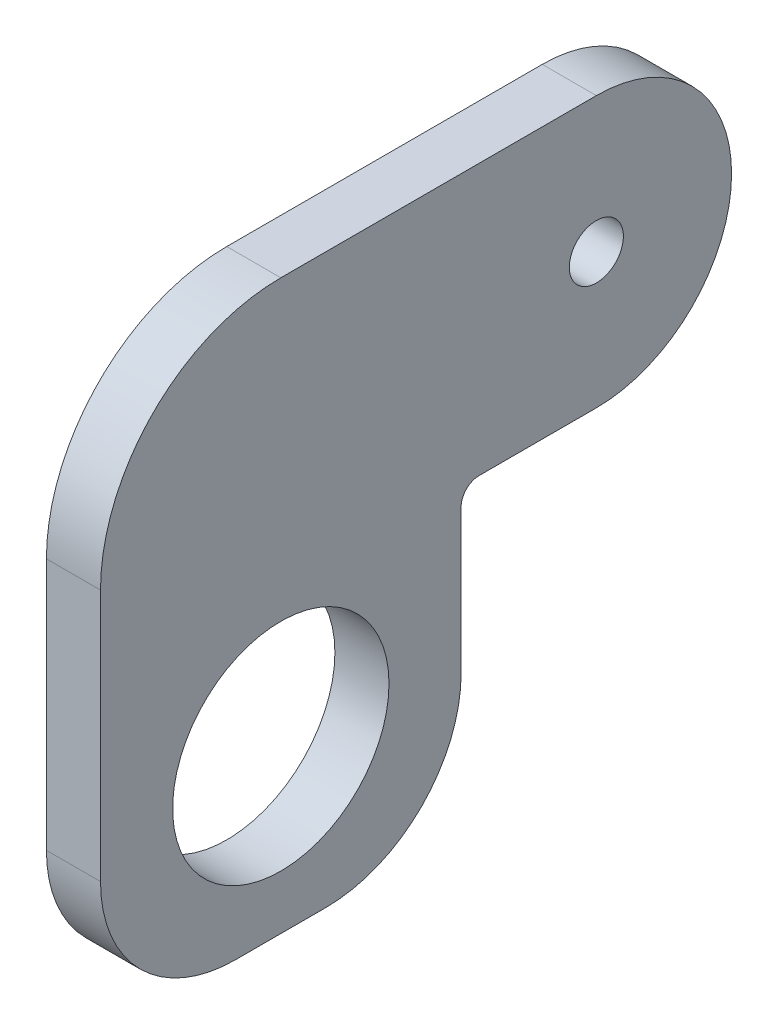
ISO-10303-21;
HEADER;
FILE_DESCRIPTION(('STEP AP214'),'2;1');
FILE_NAME('part.step','',(''),(''),'','','');
FILE_SCHEMA(('AUTOMOTIVE_DESIGN { 1 0 10303 214 1 1 1 1 }'));
ENDSEC;
DATA;
#1=APPLICATION_CONTEXT('core data for automotive mechanical design processes');
#2=APPLICATION_PROTOCOL_DEFINITION('international standard','automotive_design',2000,#1);
#3=PRODUCT_CONTEXT('',#1,'mechanical');
#4=PRODUCT('Part','Part','',(#3));
#5=PRODUCT_RELATED_PRODUCT_CATEGORY('part','',(#4));
#6=PRODUCT_DEFINITION_FORMATION('','',#4);
#7=PRODUCT_DEFINITION_CONTEXT('part definition',#1,'design');
#8=PRODUCT_DEFINITION('design','',#6,#7);
#9=PRODUCT_DEFINITION_SHAPE('','',#8);
#10=(LENGTH_UNIT() NAMED_UNIT(*) SI_UNIT(.MILLI.,.METRE.));
#11=(NAMED_UNIT(*) PLANE_ANGLE_UNIT() SI_UNIT($,.RADIAN.));
#12=(NAMED_UNIT(*) SI_UNIT($,.STERADIAN.) SOLID_ANGLE_UNIT());
#13=UNCERTAINTY_MEASURE_WITH_UNIT(LENGTH_MEASURE(1.E-05),#10,'distance_accuracy_value','');
#14=(GEOMETRIC_REPRESENTATION_CONTEXT(3) GLOBAL_UNCERTAINTY_ASSIGNED_CONTEXT((#13)) GLOBAL_UNIT_ASSIGNED_CONTEXT((#10,
#11,#12)) REPRESENTATION_CONTEXT('',''));
#15=CARTESIAN_POINT('',(0.,0.,0.));
#16=DIRECTION('',(0.,0.,1.));
#17=DIRECTION('',(1.,0.,0.));
#18=AXIS2_PLACEMENT_3D('',#15,#16,#17);
#19=CARTESIAN_POINT('',(1.5,12.5,17.5));
#20=DIRECTION('',(-1.,0.,0.));
#21=DIRECTION('',(0.,0.,1.));
#22=AXIS2_PLACEMENT_3D('',#19,#20,#21);
#23=PLANE('',#22);
#24=DIRECTION('',(0.,-1.,0.));
#25=VECTOR('',#24,1.);
#26=CARTESIAN_POINT('',(1.5,-9.,27.5));
#27=LINE('',#26,#25);
#28=CARTESIAN_POINT('',(1.5,12.4999999999999,27.5));
#29=VERTEX_POINT('',#28);
#30=CARTESIAN_POINT('',(1.5,-1.5,27.5));
#31=VERTEX_POINT('',#30);
#32=EDGE_CURVE('E142',#29,#31,#27,.T.);
#33=ORIENTED_EDGE('',*,*,#32,.T.);
#34=CARTESIAN_POINT('',(1.5,-1.5,20.));
#35=DIRECTION('',(-1.,0.,0.));
#36=DIRECTION('',(0.,0.,1.));
#37=AXIS2_PLACEMENT_3D('',#34,#35,#36);
#38=CIRCLE('',#37,7.5);
#39=CARTESIAN_POINT('',(1.5,-9.,20.));
#40=VERTEX_POINT('',#39);
#41=EDGE_CURVE('E186',#31,#40,#38,.F.);
#42=ORIENTED_EDGE('',*,*,#41,.T.);
#43=DIRECTION('',(0.,0.,-1.));
#44=VECTOR('',#43,1.);
#45=CARTESIAN_POINT('',(1.5,-9.,27.5));
#46=LINE('',#45,#44);
#47=CARTESIAN_POINT('',(1.5,-9.,15.));
#48=VERTEX_POINT('',#47);
#49=EDGE_CURVE('E144',#40,#48,#46,.T.);
#50=ORIENTED_EDGE('',*,*,#49,.T.);
#51=CARTESIAN_POINT('',(1.5,-1.5,15.));
#52=DIRECTION('',(-1.,0.,0.));
#53=DIRECTION('',(0.,0.,1.));
#54=AXIS2_PLACEMENT_3D('',#51,#52,#53);
#55=CIRCLE('',#54,7.5);
#56=CARTESIAN_POINT('',(1.5,-1.5,7.5));
#57=VERTEX_POINT('',#56);
#58=EDGE_CURVE('E184',#48,#57,#55,.F.);
#59=ORIENTED_EDGE('',*,*,#58,.T.);
#60=DIRECTION('',(0.,1.,0.));
#61=VECTOR('',#60,1.);
#62=CARTESIAN_POINT('',(1.5,-9.,7.5));
#63=LINE('',#62,#61);
#64=CARTESIAN_POINT('',(1.5,6.5,7.5));
#65=VERTEX_POINT('',#64);
#66=EDGE_CURVE('E164',#57,#65,#63,.T.);
#67=ORIENTED_EDGE('',*,*,#66,.T.);
#68=CARTESIAN_POINT('',(1.5,6.5,6.5));
#69=DIRECTION('',(-1.,0.,0.));
#70=DIRECTION('',(0.,0.,1.));
#71=AXIS2_PLACEMENT_3D('',#68,#69,#70);
#72=CIRCLE('',#71,1.);
#73=CARTESIAN_POINT('',(1.5,7.5,6.5));
#74=VERTEX_POINT('',#73);
#75=EDGE_CURVE('E11',#65,#74,#72,.T.);
#76=ORIENTED_EDGE('',*,*,#75,.T.);
#77=DIRECTION('',(0.,0.,-1.));
#78=VECTOR('',#77,1.);
#79=CARTESIAN_POINT('',(1.5,7.5,7.5));
#80=LINE('',#79,#78);
#81=CARTESIAN_POINT('',(1.5,7.5,0.));
#82=VERTEX_POINT('',#81);
#83=EDGE_CURVE('E127',#74,#82,#80,.T.);
#84=ORIENTED_EDGE('',*,*,#83,.T.);
#85=CARTESIAN_POINT('',(1.5,15.,0.));
#86=DIRECTION('',(-1.,0.,0.));
#87=DIRECTION('',(0.,0.,1.));
#88=AXIS2_PLACEMENT_3D('',#85,#86,#87);
#89=CIRCLE('',#88,7.5);
#90=CARTESIAN_POINT('',(1.5,15.,-7.5));
#91=VERTEX_POINT('',#90);
#92=EDGE_CURVE('E182',#82,#91,#89,.F.);
#93=ORIENTED_EDGE('',*,*,#92,.T.);
#94=CARTESIAN_POINT('',(1.5,15.,0.));
#95=DIRECTION('',(-1.,0.,0.));
#96=DIRECTION('',(0.,0.,1.));
#97=AXIS2_PLACEMENT_3D('',#94,#95,#96);
#98=CIRCLE('',#97,7.5);
#99=CARTESIAN_POINT('',(1.5,22.5,0.));
#100=VERTEX_POINT('',#99);
#101=EDGE_CURVE('E124',#91,#100,#98,.F.);
#102=ORIENTED_EDGE('',*,*,#101,.T.);
#103=DIRECTION('',(0.,0.,1.));
#104=VECTOR('',#103,1.);
#105=CARTESIAN_POINT('',(1.5,22.5,17.4999999999999));
#106=LINE('',#105,#104);
#107=CARTESIAN_POINT('',(1.5,22.5,17.4999999999999));
#108=VERTEX_POINT('',#107);
#109=EDGE_CURVE('E116',#100,#108,#106,.T.);
#110=ORIENTED_EDGE('',*,*,#109,.T.);
#111=CARTESIAN_POINT('',(1.5,12.5,17.5));
#112=DIRECTION('',(1.,0.,0.));
#113=DIRECTION('',(0.,0.,1.));
#114=AXIS2_PLACEMENT_3D('',#111,#112,#113);
#115=CIRCLE('',#114,10.);
#116=EDGE_CURVE('E121',#108,#29,#115,.T.);
#117=ORIENTED_EDGE('',*,*,#116,.T.);
#118=EDGE_LOOP('',(#33,#42,#50,#59,#67,#76,#84,#93,#102,#110,#117));
#119=FACE_BOUND('',#118,.T.);
#120=CARTESIAN_POINT('',(1.5,0.,17.5));
#121=DIRECTION('',(1.,0.,0.));
#122=DIRECTION('',(0.,0.,-1.));
#123=AXIS2_PLACEMENT_3D('',#120,#121,#122);
#124=CIRCLE('',#123,6.);
#125=CARTESIAN_POINT('',(1.5,0.,11.5));
#126=VERTEX_POINT('',#125);
#127=EDGE_CURVE('E153',#126,#126,#124,.T.);
#128=ORIENTED_EDGE('',*,*,#127,.F.);
#129=EDGE_LOOP('',(#128));
#130=FACE_BOUND('',#129,.T.);
#131=CARTESIAN_POINT('',(1.5,15.,0.));
#132=DIRECTION('',(1.,0.,0.));
#133=DIRECTION('',(0.,0.,-1.));
#134=AXIS2_PLACEMENT_3D('',#131,#132,#133);
#135=CIRCLE('',#134,1.5);
#136=CARTESIAN_POINT('',(1.5,15.,-1.5));
#137=VERTEX_POINT('',#136);
#138=EDGE_CURVE('E243',#137,#137,#135,.T.);
#139=ORIENTED_EDGE('',*,*,#138,.F.);
#140=EDGE_LOOP('',(#139));
#141=FACE_BOUND('',#140,.T.);
#142=ADVANCED_FACE('F34',(#119,#130,#141),#23,.F.);
#143=CARTESIAN_POINT('',(-1.5,12.5,17.5));
#144=DIRECTION('',(-1.,0.,0.));
#145=DIRECTION('',(0.,0.,1.));
#146=AXIS2_PLACEMENT_3D('',#143,#144,#145);
#147=PLANE('',#146);
#148=CARTESIAN_POINT('',(-1.5,0.,17.5));
#149=DIRECTION('',(1.,0.,0.));
#150=DIRECTION('',(0.,0.,-1.));
#151=AXIS2_PLACEMENT_3D('',#148,#149,#150);
#152=CIRCLE('',#151,6.);
#153=CARTESIAN_POINT('',(-1.5,0.,11.5));
#154=VERTEX_POINT('',#153);
#155=EDGE_CURVE('E240',#154,#154,#152,.T.);
#156=ORIENTED_EDGE('',*,*,#155,.T.);
#157=EDGE_LOOP('',(#156));
#158=FACE_BOUND('',#157,.T.);
#159=DIRECTION('',(0.,0.,-1.));
#160=VECTOR('',#159,1.);
#161=CARTESIAN_POINT('',(-1.5,-9.,27.5));
#162=LINE('',#161,#160);
#163=CARTESIAN_POINT('',(-1.5,-9.,20.));
#164=VERTEX_POINT('',#163);
#165=CARTESIAN_POINT('',(-1.5,-9.,15.));
#166=VERTEX_POINT('',#165);
#167=EDGE_CURVE('E161',#164,#166,#162,.T.);
#168=ORIENTED_EDGE('',*,*,#167,.F.);
#169=CARTESIAN_POINT('',(-1.5,-1.5,20.));
#170=DIRECTION('',(-1.,0.,0.));
#171=DIRECTION('',(0.,0.,1.));
#172=AXIS2_PLACEMENT_3D('',#169,#170,#171);
#173=CIRCLE('',#172,7.5);
#174=CARTESIAN_POINT('',(-1.5,-1.5,27.5));
#175=VERTEX_POINT('',#174);
#176=EDGE_CURVE('E177',#164,#175,#173,.T.);
#177=ORIENTED_EDGE('',*,*,#176,.T.);
#178=DIRECTION('',(0.,-1.,0.));
#179=VECTOR('',#178,1.);
#180=CARTESIAN_POINT('',(-1.5,-9.,27.5));
#181=LINE('',#180,#179);
#182=CARTESIAN_POINT('',(-1.5,12.4999999999999,27.5));
#183=VERTEX_POINT('',#182);
#184=EDGE_CURVE('E158',#183,#175,#181,.T.);
#185=ORIENTED_EDGE('',*,*,#184,.F.);
#186=CARTESIAN_POINT('',(-1.5,12.5,17.5));
#187=DIRECTION('',(1.,0.,0.));
#188=DIRECTION('',(0.,0.,1.));
#189=AXIS2_PLACEMENT_3D('',#186,#187,#188);
#190=CIRCLE('',#189,10.);
#191=CARTESIAN_POINT('',(-1.5,22.5,17.4999999999999));
#192=VERTEX_POINT('',#191);
#193=EDGE_CURVE('E156',#192,#183,#190,.T.);
#194=ORIENTED_EDGE('',*,*,#193,.F.);
#195=DIRECTION('',(0.,0.,1.));
#196=VECTOR('',#195,1.);
#197=CARTESIAN_POINT('',(-1.5,22.5,17.4999999999999));
#198=LINE('',#197,#196);
#199=CARTESIAN_POINT('',(-1.5,22.5,0.));
#200=VERTEX_POINT('',#199);
#201=EDGE_CURVE('E133',#200,#192,#198,.T.);
#202=ORIENTED_EDGE('',*,*,#201,.F.);
#203=CARTESIAN_POINT('',(-1.5,15.,0.));
#204=DIRECTION('',(-1.,0.,0.));
#205=DIRECTION('',(0.,0.,1.));
#206=AXIS2_PLACEMENT_3D('',#203,#204,#205);
#207=CIRCLE('',#206,7.5);
#208=CARTESIAN_POINT('',(-1.5,15.,-7.5));
#209=VERTEX_POINT('',#208);
#210=EDGE_CURVE('E170',#200,#209,#207,.T.);
#211=ORIENTED_EDGE('',*,*,#210,.T.);
#212=CARTESIAN_POINT('',(-1.5,15.,0.));
#213=DIRECTION('',(-1.,0.,0.));
#214=DIRECTION('',(0.,0.,1.));
#215=AXIS2_PLACEMENT_3D('',#212,#213,#214);
#216=CIRCLE('',#215,7.5);
#217=CARTESIAN_POINT('',(-1.5,7.5,0.));
#218=VERTEX_POINT('',#217);
#219=EDGE_CURVE('E172',#209,#218,#216,.T.);
#220=ORIENTED_EDGE('',*,*,#219,.T.);
#221=DIRECTION('',(0.,0.,-1.));
#222=VECTOR('',#221,1.);
#223=CARTESIAN_POINT('',(-1.5,7.5,7.5));
#224=LINE('',#223,#222);
#225=CARTESIAN_POINT('',(-1.5,7.5,6.5));
#226=VERTEX_POINT('',#225);
#227=EDGE_CURVE('E152',#226,#218,#224,.T.);
#228=ORIENTED_EDGE('',*,*,#227,.F.);
#229=CARTESIAN_POINT('',(-1.5,6.5,6.5));
#230=DIRECTION('',(-1.,0.,0.));
#231=DIRECTION('',(0.,0.,1.));
#232=AXIS2_PLACEMENT_3D('',#229,#230,#231);
#233=CIRCLE('',#232,1.);
#234=CARTESIAN_POINT('',(-1.5,6.5,7.5));
#235=VERTEX_POINT('',#234);
#236=EDGE_CURVE('E42',#226,#235,#233,.F.);
#237=ORIENTED_EDGE('',*,*,#236,.T.);
#238=DIRECTION('',(0.,1.,0.));
#239=VECTOR('',#238,1.);
#240=CARTESIAN_POINT('',(-1.5,-9.,7.5));
#241=LINE('',#240,#239);
#242=CARTESIAN_POINT('',(-1.5,-1.5,7.5));
#243=VERTEX_POINT('',#242);
#244=EDGE_CURVE('E150',#243,#235,#241,.T.);
#245=ORIENTED_EDGE('',*,*,#244,.F.);
#246=CARTESIAN_POINT('',(-1.5,-1.5,15.));
#247=DIRECTION('',(-1.,0.,0.));
#248=DIRECTION('',(0.,0.,1.));
#249=AXIS2_PLACEMENT_3D('',#246,#247,#248);
#250=CIRCLE('',#249,7.5);
#251=EDGE_CURVE('E175',#243,#166,#250,.T.);
#252=ORIENTED_EDGE('',*,*,#251,.T.);
#253=EDGE_LOOP('',(#168,#177,#185,#194,#202,#211,#220,#228,#237,#245,#252));
#254=FACE_BOUND('',#253,.T.);
#255=CARTESIAN_POINT('',(-1.5,15.,0.));
#256=DIRECTION('',(1.,0.,0.));
#257=DIRECTION('',(0.,0.,-1.));
#258=AXIS2_PLACEMENT_3D('',#255,#256,#257);
#259=CIRCLE('',#258,1.5);
#260=CARTESIAN_POINT('',(-1.5,15.,-1.5));
#261=VERTEX_POINT('',#260);
#262=EDGE_CURVE('E200',#261,#261,#259,.T.);
#263=ORIENTED_EDGE('',*,*,#262,.T.);
#264=EDGE_LOOP('',(#263));
#265=FACE_BOUND('',#264,.T.);
#266=ADVANCED_FACE('F210',(#158,#254,#265),#147,.T.);
#267=CARTESIAN_POINT('',(1.5,-9.,7.5));
#268=DIRECTION('',(0.,0.,1.));
#269=DIRECTION('',(0.,-1.,0.));
#270=AXIS2_PLACEMENT_3D('',#267,#268,#269);
#271=PLANE('',#270);
#272=ORIENTED_EDGE('',*,*,#244,.T.);
#273=DIRECTION('',(-1.,0.,0.));
#274=VECTOR('',#273,1.);
#275=CARTESIAN_POINT('',(1.5,6.5,7.5));
#276=LINE('',#275,#274);
#277=EDGE_CURVE('E55',#235,#65,#276,.F.);
#278=ORIENTED_EDGE('',*,*,#277,.T.);
#279=ORIENTED_EDGE('',*,*,#66,.F.);
#280=DIRECTION('',(-1.,0.,0.));
#281=VECTOR('',#280,1.);
#282=CARTESIAN_POINT('',(1.5,-1.5,7.5));
#283=LINE('',#282,#281);
#284=EDGE_CURVE('E188',#57,#243,#283,.T.);
#285=ORIENTED_EDGE('',*,*,#284,.T.);
#286=EDGE_LOOP('',(#272,#278,#279,#285));
#287=FACE_BOUND('',#286,.T.);
#288=ADVANCED_FACE('F237',(#287),#271,.F.);
#289=CARTESIAN_POINT('',(1.5,7.5,7.5));
#290=DIRECTION('',(0.,1.,0.));
#291=DIRECTION('',(0.,0.,1.));
#292=AXIS2_PLACEMENT_3D('',#289,#290,#291);
#293=PLANE('',#292);
#294=ORIENTED_EDGE('',*,*,#83,.F.);
#295=DIRECTION('',(-1.,0.,0.));
#296=VECTOR('',#295,1.);
#297=CARTESIAN_POINT('',(-1.5,7.5,6.5));
#298=LINE('',#297,#296);
#299=EDGE_CURVE('E196',#74,#226,#298,.T.);
#300=ORIENTED_EDGE('',*,*,#299,.T.);
#301=ORIENTED_EDGE('',*,*,#227,.T.);
#302=DIRECTION('',(-1.,0.,0.));
#303=VECTOR('',#302,1.);
#304=CARTESIAN_POINT('',(1.5,7.5,0.));
#305=LINE('',#304,#303);
#306=EDGE_CURVE('E191',#218,#82,#305,.F.);
#307=ORIENTED_EDGE('',*,*,#306,.T.);
#308=EDGE_LOOP('',(#294,#300,#301,#307));
#309=FACE_BOUND('',#308,.T.);
#310=ADVANCED_FACE('F206',(#309),#293,.F.);
#311=CARTESIAN_POINT('',(1.5,22.5,17.4999999999999));
#312=DIRECTION('',(0.,-1.,0.));
#313=DIRECTION('',(0.,0.,-1.));
#314=AXIS2_PLACEMENT_3D('',#311,#312,#313);
#315=PLANE('',#314);
#316=ORIENTED_EDGE('',*,*,#109,.F.);
#317=DIRECTION('',(-1.,0.,0.));
#318=VECTOR('',#317,1.);
#319=CARTESIAN_POINT('',(1.5,22.5,0.));
#320=LINE('',#319,#318);
#321=EDGE_CURVE('E194',#100,#200,#320,.T.);
#322=ORIENTED_EDGE('',*,*,#321,.T.);
#323=ORIENTED_EDGE('',*,*,#201,.T.);
#324=DIRECTION('',(-1.,0.,0.));
#325=VECTOR('',#324,1.);
#326=CARTESIAN_POINT('',(1.5,22.5,17.4999999999999));
#327=LINE('',#326,#325);
#328=EDGE_CURVE('E130',#108,#192,#327,.T.);
#329=ORIENTED_EDGE('',*,*,#328,.F.);
#330=EDGE_LOOP('',(#316,#322,#323,#329));
#331=FACE_BOUND('',#330,.T.);
#332=ADVANCED_FACE('F131',(#331),#315,.F.);
#333=CARTESIAN_POINT('',(1.5,12.5,17.5));
#334=DIRECTION('',(-1.,0.,0.));
#335=DIRECTION('',(0.,0.,1.));
#336=AXIS2_PLACEMENT_3D('',#333,#334,#335);
#337=CYLINDRICAL_SURFACE('',#336,10.);
#338=ORIENTED_EDGE('',*,*,#193,.T.);
#339=DIRECTION('',(-1.,0.,0.));
#340=VECTOR('',#339,1.);
#341=CARTESIAN_POINT('',(1.5,12.4999999999999,27.5));
#342=LINE('',#341,#340);
#343=EDGE_CURVE('E137',#29,#183,#342,.T.);
#344=ORIENTED_EDGE('',*,*,#343,.F.);
#345=ORIENTED_EDGE('',*,*,#116,.F.);
#346=ORIENTED_EDGE('',*,*,#328,.T.);
#347=EDGE_LOOP('',(#338,#344,#345,#346));
#348=FACE_BOUND('',#347,.T.);
#349=ADVANCED_FACE('F139',(#348),#337,.T.);
#350=CARTESIAN_POINT('',(1.5,-9.,27.5));
#351=DIRECTION('',(0.,0.,-1.));
#352=DIRECTION('',(-1.,0.,0.));
#353=AXIS2_PLACEMENT_3D('',#350,#351,#352);
#354=PLANE('',#353);
#355=ORIENTED_EDGE('',*,*,#184,.T.);
#356=DIRECTION('',(-1.,0.,0.));
#357=VECTOR('',#356,1.);
#358=CARTESIAN_POINT('',(1.5,-1.5,27.5));
#359=LINE('',#358,#357);
#360=EDGE_CURVE('E179',#175,#31,#359,.F.);
#361=ORIENTED_EDGE('',*,*,#360,.T.);
#362=ORIENTED_EDGE('',*,*,#32,.F.);
#363=ORIENTED_EDGE('',*,*,#343,.T.);
#364=EDGE_LOOP('',(#355,#361,#362,#363));
#365=FACE_BOUND('',#364,.T.);
#366=ADVANCED_FACE('F223',(#365),#354,.F.);
#367=CARTESIAN_POINT('',(1.5,-9.,27.5));
#368=DIRECTION('',(0.,1.,0.));
#369=DIRECTION('',(0.,0.,1.));
#370=AXIS2_PLACEMENT_3D('',#367,#368,#369);
#371=PLANE('',#370);
#372=ORIENTED_EDGE('',*,*,#49,.F.);
#373=DIRECTION('',(-1.,0.,0.));
#374=VECTOR('',#373,1.);
#375=CARTESIAN_POINT('',(1.5,-9.,20.));
#376=LINE('',#375,#374);
#377=EDGE_CURVE('E167',#40,#164,#376,.T.);
#378=ORIENTED_EDGE('',*,*,#377,.T.);
#379=ORIENTED_EDGE('',*,*,#167,.T.);
#380=DIRECTION('',(-1.,0.,0.));
#381=VECTOR('',#380,1.);
#382=CARTESIAN_POINT('',(1.5,-9.,15.));
#383=LINE('',#382,#381);
#384=EDGE_CURVE('E136',#166,#48,#383,.F.);
#385=ORIENTED_EDGE('',*,*,#384,.T.);
#386=EDGE_LOOP('',(#372,#378,#379,#385));
#387=FACE_BOUND('',#386,.T.);
#388=ADVANCED_FACE('F231',(#387),#371,.F.);
#389=CARTESIAN_POINT('',(1.5,0.,17.5));
#390=DIRECTION('',(-1.,0.,0.));
#391=DIRECTION('',(0.,0.,1.));
#392=AXIS2_PLACEMENT_3D('',#389,#390,#391);
#393=CYLINDRICAL_SURFACE('',#392,6.);
#394=ORIENTED_EDGE('',*,*,#127,.T.);
#395=EDGE_LOOP('',(#394));
#396=FACE_BOUND('',#395,.T.);
#397=ORIENTED_EDGE('',*,*,#155,.F.);
#398=EDGE_LOOP('',(#397));
#399=FACE_BOUND('',#398,.T.);
#400=ADVANCED_FACE('F262',(#396,#399),#393,.F.);
#401=CARTESIAN_POINT('',(1.5,15.,0.));
#402=DIRECTION('',(-1.,0.,0.));
#403=DIRECTION('',(0.,0.,1.));
#404=AXIS2_PLACEMENT_3D('',#401,#402,#403);
#405=CYLINDRICAL_SURFACE('',#404,1.5);
#406=ORIENTED_EDGE('',*,*,#138,.T.);
#407=EDGE_LOOP('',(#406));
#408=FACE_BOUND('',#407,.T.);
#409=ORIENTED_EDGE('',*,*,#262,.F.);
#410=EDGE_LOOP('',(#409));
#411=FACE_BOUND('',#410,.T.);
#412=ADVANCED_FACE('F251',(#408,#411),#405,.F.);
#413=CARTESIAN_POINT('',(1.5,-1.5,20.));
#414=DIRECTION('',(-1.,0.,0.));
#415=DIRECTION('',(0.,0.,1.));
#416=AXIS2_PLACEMENT_3D('',#413,#414,#415);
#417=CYLINDRICAL_SURFACE('',#416,7.5);
#418=ORIENTED_EDGE('',*,*,#41,.F.);
#419=ORIENTED_EDGE('',*,*,#360,.F.);
#420=ORIENTED_EDGE('',*,*,#176,.F.);
#421=ORIENTED_EDGE('',*,*,#377,.F.);
#422=EDGE_LOOP('',(#418,#419,#420,#421));
#423=FACE_BOUND('',#422,.T.);
#424=ADVANCED_FACE('F229',(#423),#417,.T.);
#425=CARTESIAN_POINT('',(1.5,-1.5,15.));
#426=DIRECTION('',(-1.,0.,0.));
#427=DIRECTION('',(0.,0.,1.));
#428=AXIS2_PLACEMENT_3D('',#425,#426,#427);
#429=CYLINDRICAL_SURFACE('',#428,7.5);
#430=ORIENTED_EDGE('',*,*,#58,.F.);
#431=ORIENTED_EDGE('',*,*,#384,.F.);
#432=ORIENTED_EDGE('',*,*,#251,.F.);
#433=ORIENTED_EDGE('',*,*,#284,.F.);
#434=EDGE_LOOP('',(#430,#431,#432,#433));
#435=FACE_BOUND('',#434,.T.);
#436=ADVANCED_FACE('F236',(#435),#429,.T.);
#437=CARTESIAN_POINT('',(1.5,15.,0.));
#438=DIRECTION('',(-1.,0.,0.));
#439=DIRECTION('',(0.,0.,1.));
#440=AXIS2_PLACEMENT_3D('',#437,#438,#439);
#441=CYLINDRICAL_SURFACE('',#440,7.5);
#442=ORIENTED_EDGE('',*,*,#321,.F.);
#443=ORIENTED_EDGE('',*,*,#101,.F.);
#444=DIRECTION('',(-1.,0.,0.));
#445=VECTOR('',#444,1.);
#446=CARTESIAN_POINT('',(1.5,15.,-7.5));
#447=LINE('',#446,#445);
#448=EDGE_CURVE('E197',#209,#91,#447,.F.);
#449=ORIENTED_EDGE('',*,*,#448,.F.);
#450=ORIENTED_EDGE('',*,*,#210,.F.);
#451=EDGE_LOOP('',(#442,#443,#449,#450));
#452=FACE_BOUND('',#451,.T.);
#453=ADVANCED_FACE('F220',(#452),#441,.T.);
#454=CARTESIAN_POINT('',(1.5,15.,0.));
#455=DIRECTION('',(-1.,0.,0.));
#456=DIRECTION('',(0.,0.,1.));
#457=AXIS2_PLACEMENT_3D('',#454,#455,#456);
#458=CYLINDRICAL_SURFACE('',#457,7.5);
#459=ORIENTED_EDGE('',*,*,#92,.F.);
#460=ORIENTED_EDGE('',*,*,#306,.F.);
#461=ORIENTED_EDGE('',*,*,#219,.F.);
#462=ORIENTED_EDGE('',*,*,#448,.T.);
#463=EDGE_LOOP('',(#459,#460,#461,#462));
#464=FACE_BOUND('',#463,.T.);
#465=ADVANCED_FACE('F218',(#464),#458,.T.);
#466=CARTESIAN_POINT('',(1.5,6.5,6.5));
#467=DIRECTION('',(1.,0.,0.));
#468=DIRECTION('',(0.,0.,-1.));
#469=AXIS2_PLACEMENT_3D('',#466,#467,#468);
#470=CYLINDRICAL_SURFACE('',#469,1.);
#471=ORIENTED_EDGE('',*,*,#75,.F.);
#472=ORIENTED_EDGE('',*,*,#277,.F.);
#473=ORIENTED_EDGE('',*,*,#236,.F.);
#474=ORIENTED_EDGE('',*,*,#299,.F.);
#475=EDGE_LOOP('',(#471,#472,#473,#474));
#476=FACE_BOUND('',#475,.T.);
#477=ADVANCED_FACE('F36',(#476),#470,.F.);
#478=CLOSED_SHELL('',(#142,#266,#288,#310,#332,#349,#366,#388,#400,#412,#424,#436,#453,#465,#477));
#479=MANIFOLD_SOLID_BREP('B2',#478);
#480=ADVANCED_BREP_SHAPE_REPRESENTATION('',(#18,#479),#14);
#481=SHAPE_DEFINITION_REPRESENTATION(#9,#480);
ENDSEC;
END-ISO-10303-21;
